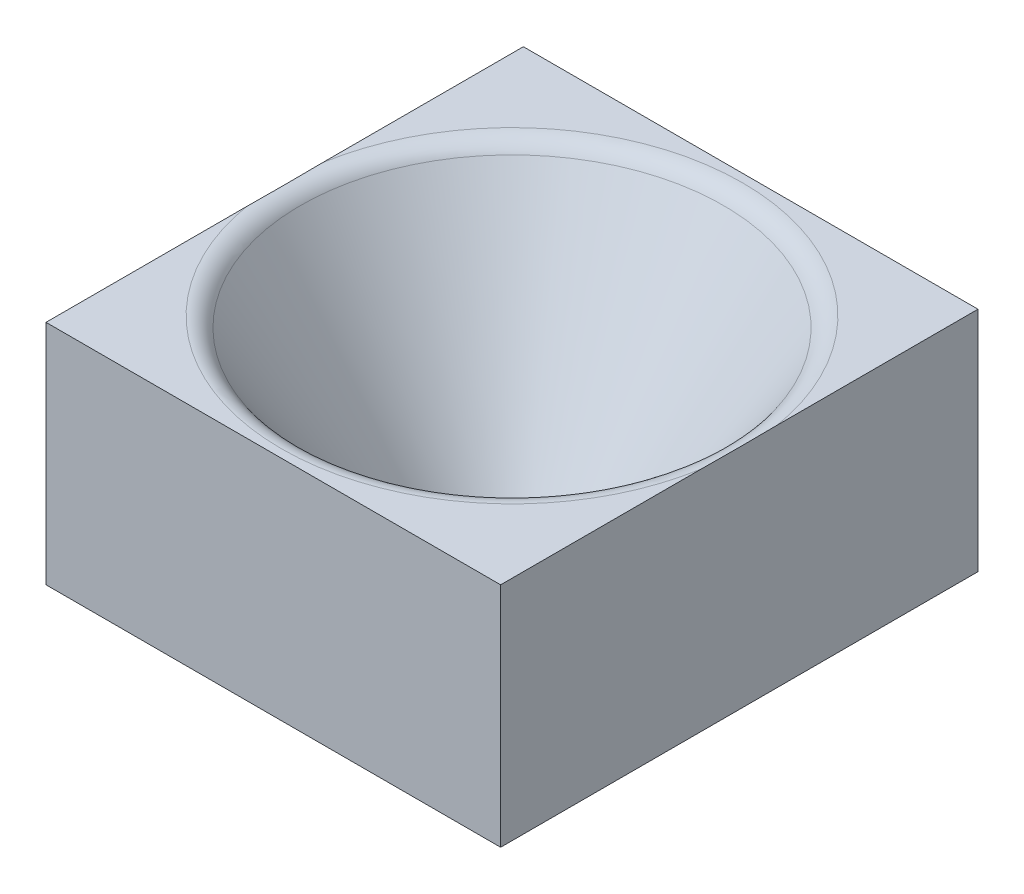
ISO-10303-21;
HEADER;
FILE_DESCRIPTION(('STEP AP214'),'2;1');
FILE_NAME('part.step','',(''),(''),'','','');
FILE_SCHEMA(('AUTOMOTIVE_DESIGN { 1 0 10303 214 1 1 1 1 }'));
ENDSEC;
DATA;
#1=APPLICATION_CONTEXT('core data for automotive mechanical design processes');
#2=APPLICATION_PROTOCOL_DEFINITION('international standard','automotive_design',2000,#1);
#3=PRODUCT_CONTEXT('',#1,'mechanical');
#4=PRODUCT('Part','Part','',(#3));
#5=PRODUCT_RELATED_PRODUCT_CATEGORY('part','',(#4));
#6=PRODUCT_DEFINITION_FORMATION('','',#4);
#7=PRODUCT_DEFINITION_CONTEXT('part definition',#1,'design');
#8=PRODUCT_DEFINITION('design','',#6,#7);
#9=PRODUCT_DEFINITION_SHAPE('','',#8);
#10=(LENGTH_UNIT() NAMED_UNIT(*) SI_UNIT(.MILLI.,.METRE.));
#11=(NAMED_UNIT(*) PLANE_ANGLE_UNIT() SI_UNIT($,.RADIAN.));
#12=(NAMED_UNIT(*) SI_UNIT($,.STERADIAN.) SOLID_ANGLE_UNIT());
#13=UNCERTAINTY_MEASURE_WITH_UNIT(LENGTH_MEASURE(1.E-05),#10,'distance_accuracy_value','');
#14=(GEOMETRIC_REPRESENTATION_CONTEXT(3) GLOBAL_UNCERTAINTY_ASSIGNED_CONTEXT((#13)) GLOBAL_UNIT_ASSIGNED_CONTEXT((#10,
#11,#12)) REPRESENTATION_CONTEXT('',''));
#15=CARTESIAN_POINT('',(0.,0.,0.));
#16=DIRECTION('',(0.,0.,1.));
#17=DIRECTION('',(1.,0.,0.));
#18=AXIS2_PLACEMENT_3D('',#15,#16,#17);
#19=CARTESIAN_POINT('',(-17.3,30.,48.5732994259089));
#20=DIRECTION('',(-1.,0.,0.));
#21=DIRECTION('',(0.,0.,1.));
#22=AXIS2_PLACEMENT_3D('',#19,#20,#21);
#23=PLANE('',#22);
#24=DIRECTION('',(0.,0.,1.));
#25=VECTOR('',#24,1.);
#26=CARTESIAN_POINT('',(-17.3,12.,48.5732994259089));
#27=LINE('',#26,#25);
#28=CARTESIAN_POINT('',(-17.3,12.,36.0732994259089));
#29=VERTEX_POINT('',#28);
#30=CARTESIAN_POINT('',(-17.3,12.,48.5732994259089));
#31=VERTEX_POINT('',#30);
#32=EDGE_CURVE('E176',#29,#31,#27,.T.);
#33=ORIENTED_EDGE('',*,*,#32,.F.);
#34=DIRECTION('',(0.,-1.,0.));
#35=VECTOR('',#34,1.);
#36=CARTESIAN_POINT('',(-17.3,30.,36.0732994259089));
#37=LINE('',#36,#35);
#38=CARTESIAN_POINT('',(-17.3,30.,36.0732994259089));
#39=VERTEX_POINT('',#38);
#40=EDGE_CURVE('E151',#39,#29,#37,.T.);
#41=ORIENTED_EDGE('',*,*,#40,.F.);
#42=DIRECTION('',(0.,0.,-1.));
#43=VECTOR('',#42,1.);
#44=CARTESIAN_POINT('',(-17.3,30.,48.5732994259089));
#45=LINE('',#44,#43);
#46=CARTESIAN_POINT('',(-17.3,30.,48.5732994259089));
#47=VERTEX_POINT('',#46);
#48=EDGE_CURVE('E179',#47,#39,#45,.T.);
#49=ORIENTED_EDGE('',*,*,#48,.F.);
#50=DIRECTION('',(0.,-1.,0.));
#51=VECTOR('',#50,1.);
#52=CARTESIAN_POINT('',(-17.3,30.,48.5732994259089));
#53=LINE('',#52,#51);
#54=EDGE_CURVE('E194',#47,#31,#53,.T.);
#55=ORIENTED_EDGE('',*,*,#54,.T.);
#56=EDGE_LOOP('',(#33,#41,#49,#55));
#57=FACE_BOUND('',#56,.T.);
#58=ADVANCED_FACE('F34',(#57),#23,.F.);
#59=CARTESIAN_POINT('',(5.2,30.,48.5732994259089));
#60=DIRECTION('',(1.,0.,0.));
#61=DIRECTION('',(0.,0.,-1.));
#62=AXIS2_PLACEMENT_3D('',#59,#60,#61);
#63=PLANE('',#62);
#64=DIRECTION('',(0.,0.,-1.));
#65=VECTOR('',#64,1.);
#66=CARTESIAN_POINT('',(5.2,12.,48.5732994259089));
#67=LINE('',#66,#65);
#68=CARTESIAN_POINT('',(5.2,12.,48.5732994259089));
#69=VERTEX_POINT('',#68);
#70=CARTESIAN_POINT('',(5.2,12.,36.0732994259089));
#71=VERTEX_POINT('',#70);
#72=EDGE_CURVE('E169',#69,#71,#67,.T.);
#73=ORIENTED_EDGE('',*,*,#72,.F.);
#74=DIRECTION('',(0.,-1.,0.));
#75=VECTOR('',#74,1.);
#76=CARTESIAN_POINT('',(5.2,30.,48.5732994259089));
#77=LINE('',#76,#75);
#78=CARTESIAN_POINT('',(5.2,30.,48.5732994259089));
#79=VERTEX_POINT('',#78);
#80=EDGE_CURVE('E198',#79,#69,#77,.T.);
#81=ORIENTED_EDGE('',*,*,#80,.F.);
#82=DIRECTION('',(0.,0.,1.));
#83=VECTOR('',#82,1.);
#84=CARTESIAN_POINT('',(5.2,30.,48.5732994259089));
#85=LINE('',#84,#83);
#86=CARTESIAN_POINT('',(5.2,30.,36.0732994259089));
#87=VERTEX_POINT('',#86);
#88=EDGE_CURVE('E186',#87,#79,#85,.T.);
#89=ORIENTED_EDGE('',*,*,#88,.F.);
#90=DIRECTION('',(0.,-1.,0.));
#91=VECTOR('',#90,1.);
#92=CARTESIAN_POINT('',(5.2,30.,36.0732994259089));
#93=LINE('',#92,#91);
#94=EDGE_CURVE('E201',#87,#71,#93,.T.);
#95=ORIENTED_EDGE('',*,*,#94,.T.);
#96=EDGE_LOOP('',(#73,#81,#89,#95));
#97=FACE_BOUND('',#96,.T.);
#98=ADVANCED_FACE('F274',(#97),#63,.F.);
#99=CARTESIAN_POINT('',(0.,50.,0.));
#100=DIRECTION('',(0.,1.,0.));
#101=DIRECTION('',(0.,0.,1.));
#102=AXIS2_PLACEMENT_3D('',#99,#100,#101);
#103=PLANE('',#102);
#104=DIRECTION('',(0.,0.,1.));
#105=VECTOR('',#104,1.);
#106=CARTESIAN_POINT('',(-50.,50.,-52.5));
#107=LINE('',#106,#105);
#108=CARTESIAN_POINT('',(-50.,50.,-52.5));
#109=VERTEX_POINT('',#108);
#110=CARTESIAN_POINT('',(-50.,50.,-8.34025617321344));
#111=VERTEX_POINT('',#110);
#112=EDGE_CURVE('E208',#109,#111,#107,.T.);
#113=ORIENTED_EDGE('',*,*,#112,.T.);
#114=CARTESIAN_POINT('',(0.,50.,0.));
#115=DIRECTION('',(0.,1.,0.));
#116=DIRECTION('',(0.,0.,1.));
#117=AXIS2_PLACEMENT_3D('',#114,#115,#116);
#118=CIRCLE('',#117,50.6908263203001);
#119=CARTESIAN_POINT('',(50.,50.,-8.34025617321344));
#120=VERTEX_POINT('',#119);
#121=EDGE_CURVE('E242',#111,#120,#118,.F.);
#122=ORIENTED_EDGE('',*,*,#121,.T.);
#123=DIRECTION('',(0.,0.,-1.));
#124=VECTOR('',#123,1.);
#125=CARTESIAN_POINT('',(50.,50.,-52.5));
#126=LINE('',#125,#124);
#127=CARTESIAN_POINT('',(50.,50.,-52.5));
#128=VERTEX_POINT('',#127);
#129=EDGE_CURVE('E214',#120,#128,#126,.T.);
#130=ORIENTED_EDGE('',*,*,#129,.T.);
#131=DIRECTION('',(-1.,0.,0.));
#132=VECTOR('',#131,1.);
#133=CARTESIAN_POINT('',(-50.,50.,-52.5));
#134=LINE('',#133,#132);
#135=EDGE_CURVE('E218',#128,#109,#134,.T.);
#136=ORIENTED_EDGE('',*,*,#135,.T.);
#137=EDGE_LOOP('',(#113,#122,#130,#136));
#138=FACE_BOUND('',#137,.T.);
#139=ADVANCED_FACE('F269',(#138),#103,.T.);
#140=CARTESIAN_POINT('',(-50.,50.,-52.5));
#141=DIRECTION('',(1.,0.,0.));
#142=DIRECTION('',(0.,0.,-1.));
#143=AXIS2_PLACEMENT_3D('',#140,#141,#142);
#144=PLANE('',#143);
#145=CARTESIAN_POINT('',(-50.,50.,8.34025617321344));
#146=VERTEX_POINT('',#145);
#147=CARTESIAN_POINT('',(-50.,50.,52.5));
#148=VERTEX_POINT('',#147);
#149=EDGE_CURVE('E212',#146,#148,#107,.T.);
#150=ORIENTED_EDGE('',*,*,#149,.F.);
#151=CARTESIAN_POINT('',(-50.,50.,8.34025617321344));
#152=CARTESIAN_POINT('',(-50.,49.999969519548,7.92357488045374));
#153=CARTESIAN_POINT('',(-50.,49.9985889554185,7.50689862755486));
#154=CARTESIAN_POINT('',(-50.,49.9941415827131,6.67355809485329));
#155=CARTESIAN_POINT('',(-50.,49.9910747889397,6.25689381497759));
#156=CARTESIAN_POINT('',(-50.,49.9842687425218,5.42355941569079));
#157=CARTESIAN_POINT('',(-50.,49.9805294698827,5.0068892964745));
#158=CARTESIAN_POINT('',(-50.,49.9731743613539,4.17354696788151));
#159=CARTESIAN_POINT('',(-50.,49.9695585256897,3.75687475850238));
#160=CARTESIAN_POINT('',(-50.,49.9630782107833,2.92354241923249));
#161=CARTESIAN_POINT('',(-50.,49.9602136987209,2.50688228960933));
#162=CARTESIAN_POINT('',(-50.,49.9556705476822,1.67355563993624));
#163=CARTESIAN_POINT('',(-50.,49.9539919075349,1.25688911989303));
#164=CARTESIAN_POINT('',(-50.,49.9520592996897,0.423560225945266));
#165=CARTESIAN_POINT('',(-50.,49.9518053059902,0.0068978521038454));
#166=CARTESIAN_POINT('',(-50.,49.9527544558587,-0.826425291643721));
#167=CARTESIAN_POINT('',(-50.,49.9539575999139,-1.24308606154928));
#168=CARTESIAN_POINT('',(-50.,49.9582846415786,-2.21644720256942));
#169=CARTESIAN_POINT('',(-50.,49.9619182119532,-2.77314521439534));
#170=CARTESIAN_POINT('',(-50.,49.97055742349,-3.88653516263361));
#171=CARTESIAN_POINT('',(-50.,49.9755630791267,-4.44322709891992));
#172=CARTESIAN_POINT('',(-50.,49.9853841369986,-5.55663372886826));
#173=CARTESIAN_POINT('',(-50.,49.9901995322325,-6.11334842261453));
#174=CARTESIAN_POINT('',(-50.,49.9956771546948,-6.94843121544724));
#175=CARTESIAN_POINT('',(-50.,49.9972121147607,-7.22679294777492));
#176=CARTESIAN_POINT('',(-50.,49.9993713262338,-7.78352143427091));
#177=CARTESIAN_POINT('',(-50.,49.9999955721802,-8.06188818845933));
#178=CARTESIAN_POINT('',(-50.,50.,-8.34025617321344));
#179=B_SPLINE_CURVE_WITH_KNOTS('',3,(#151,#152,#153,#154,#155,#156,#157,#158,#159,#160,#161,
#162,#163,#164,#165,#166,#167,#168,#169,#170,#171,#172,#173,#174,#175,#176,#177,#178),
.UNSPECIFIED.,.F.,.F.,(4,2,2,2,2,2,2,2,2,2,2,2,2,4),(0.,1.25003492526919,2.50005887721272,
3.7501200017694,5.00018340936057,6.25019220102845,7.50019975841729,8.75018450153355,
10.0001696624963,11.670295643204,13.3404392431921,15.0106442443051,15.8457408010041,
16.6808423649642),.UNSPECIFIED.);
#180=EDGE_CURVE('E43',#146,#111,#179,.T.);
#181=ORIENTED_EDGE('',*,*,#180,.T.);
#182=ORIENTED_EDGE('',*,*,#112,.F.);
#183=DIRECTION('',(0.,-1.,0.));
#184=VECTOR('',#183,1.);
#185=CARTESIAN_POINT('',(-50.,50.,-52.5));
#186=LINE('',#185,#184);
#187=CARTESIAN_POINT('',(-50.,0.,-52.5));
#188=VERTEX_POINT('',#187);
#189=EDGE_CURVE('E220',#109,#188,#186,.T.);
#190=ORIENTED_EDGE('',*,*,#189,.T.);
#191=DIRECTION('',(0.,0.,1.));
#192=VECTOR('',#191,1.);
#193=CARTESIAN_POINT('',(-50.,0.,-52.5));
#194=LINE('',#193,#192);
#195=CARTESIAN_POINT('',(-50.,0.,52.5));
#196=VERTEX_POINT('',#195);
#197=EDGE_CURVE('E207',#188,#196,#194,.T.);
#198=ORIENTED_EDGE('',*,*,#197,.T.);
#199=DIRECTION('',(0.,-1.,0.));
#200=VECTOR('',#199,1.);
#201=CARTESIAN_POINT('',(-50.,50.,52.5));
#202=LINE('',#201,#200);
#203=EDGE_CURVE('E237',#148,#196,#202,.T.);
#204=ORIENTED_EDGE('',*,*,#203,.F.);
#205=EDGE_LOOP('',(#150,#181,#182,#190,#198,#204));
#206=FACE_BOUND('',#205,.T.);
#207=ADVANCED_FACE('F265',(#206),#144,.F.);
#208=CARTESIAN_POINT('',(-50.,50.,52.5));
#209=DIRECTION('',(0.,0.,-1.));
#210=DIRECTION('',(-1.,0.,0.));
#211=AXIS2_PLACEMENT_3D('',#208,#209,#210);
#212=PLANE('',#211);
#213=DIRECTION('',(1.,0.,0.));
#214=VECTOR('',#213,1.);
#215=CARTESIAN_POINT('',(-50.,0.,52.5));
#216=LINE('',#215,#214);
#217=CARTESIAN_POINT('',(50.,0.,52.5));
#218=VERTEX_POINT('',#217);
#219=EDGE_CURVE('E223',#196,#218,#216,.T.);
#220=ORIENTED_EDGE('',*,*,#219,.T.);
#221=DIRECTION('',(0.,-1.,0.));
#222=VECTOR('',#221,1.);
#223=CARTESIAN_POINT('',(50.,50.,52.5));
#224=LINE('',#223,#222);
#225=CARTESIAN_POINT('',(50.,50.,52.5));
#226=VERTEX_POINT('',#225);
#227=EDGE_CURVE('E234',#226,#218,#224,.T.);
#228=ORIENTED_EDGE('',*,*,#227,.F.);
#229=DIRECTION('',(1.,0.,0.));
#230=VECTOR('',#229,1.);
#231=CARTESIAN_POINT('',(-50.,50.,52.5));
#232=LINE('',#231,#230);
#233=EDGE_CURVE('E211',#148,#226,#232,.T.);
#234=ORIENTED_EDGE('',*,*,#233,.F.);
#235=ORIENTED_EDGE('',*,*,#203,.T.);
#236=EDGE_LOOP('',(#220,#228,#234,#235));
#237=FACE_BOUND('',#236,.T.);
#238=ADVANCED_FACE('F261',(#237),#212,.F.);
#239=CARTESIAN_POINT('',(50.,50.,-52.5));
#240=DIRECTION('',(-1.,0.,0.));
#241=DIRECTION('',(0.,0.,1.));
#242=AXIS2_PLACEMENT_3D('',#239,#240,#241);
#243=PLANE('',#242);
#244=ORIENTED_EDGE('',*,*,#129,.F.);
#245=CARTESIAN_POINT('',(50.,50.,-8.34025617321344));
#246=CARTESIAN_POINT('',(50.,49.999969519548,-7.92357488045374));
#247=CARTESIAN_POINT('',(50.,49.9985889554185,-7.50689862755486));
#248=CARTESIAN_POINT('',(50.,49.9941415827131,-6.67355809485329));
#249=CARTESIAN_POINT('',(50.,49.9910747889397,-6.25689381497759));
#250=CARTESIAN_POINT('',(50.,49.9842687425218,-5.42355941569079));
#251=CARTESIAN_POINT('',(50.,49.9805294698827,-5.0068892964745));
#252=CARTESIAN_POINT('',(50.,49.9731743613539,-4.17354696788151));
#253=CARTESIAN_POINT('',(50.,49.9695585256897,-3.75687475850238));
#254=CARTESIAN_POINT('',(50.,49.9630782107833,-2.92354241923249));
#255=CARTESIAN_POINT('',(50.,49.9602136987209,-2.50688228960933));
#256=CARTESIAN_POINT('',(50.,49.9556705476822,-1.67355563993624));
#257=CARTESIAN_POINT('',(50.,49.9539919075349,-1.25688911989303));
#258=CARTESIAN_POINT('',(50.,49.9520592996897,-0.423560225945266));
#259=CARTESIAN_POINT('',(50.,49.9518053059902,-0.0068978521038454));
#260=CARTESIAN_POINT('',(50.,49.9527544558587,0.826425291643721));
#261=CARTESIAN_POINT('',(50.,49.9539575999139,1.24308606154928));
#262=CARTESIAN_POINT('',(50.,49.9582846415786,2.21644720256942));
#263=CARTESIAN_POINT('',(50.,49.9619182119532,2.77314521439534));
#264=CARTESIAN_POINT('',(50.,49.97055742349,3.88653516263361));
#265=CARTESIAN_POINT('',(50.,49.9755630791267,4.44322709891992));
#266=CARTESIAN_POINT('',(50.,49.9853841369986,5.55663372886826));
#267=CARTESIAN_POINT('',(50.,49.9901995322325,6.11334842261453));
#268=CARTESIAN_POINT('',(50.,49.9956771546948,6.94843121544724));
#269=CARTESIAN_POINT('',(50.,49.9972121147607,7.22679294777492));
#270=CARTESIAN_POINT('',(50.,49.9993713262338,7.78352143427091));
#271=CARTESIAN_POINT('',(50.,49.9999955721802,8.06188818845933));
#272=CARTESIAN_POINT('',(50.,50.,8.34025617321344));
#273=B_SPLINE_CURVE_WITH_KNOTS('',3,(#245,#246,#247,#248,#249,#250,#251,#252,#253,#254,#255,
#256,#257,#258,#259,#260,#261,#262,#263,#264,#265,#266,#267,#268,#269,#270,#271,#272),
.UNSPECIFIED.,.F.,.F.,(4,2,2,2,2,2,2,2,2,2,2,2,2,4),(0.,1.25003492526919,2.50005887721272,
3.7501200017694,5.00018340936057,6.25019220102845,7.50019975841729,8.75018450153355,
10.0001696624963,11.670295643204,13.3404392431921,15.0106442443051,15.8457408010041,
16.6808423649642),.UNSPECIFIED.);
#274=CARTESIAN_POINT('',(50.,50.,8.34025617321344));
#275=VERTEX_POINT('',#274);
#276=EDGE_CURVE('E245',#120,#275,#273,.T.);
#277=ORIENTED_EDGE('',*,*,#276,.T.);
#278=EDGE_CURVE('E215',#226,#275,#126,.T.);
#279=ORIENTED_EDGE('',*,*,#278,.F.);
#280=ORIENTED_EDGE('',*,*,#227,.T.);
#281=DIRECTION('',(0.,0.,-1.));
#282=VECTOR('',#281,1.);
#283=CARTESIAN_POINT('',(50.,0.,-52.5));
#284=LINE('',#283,#282);
#285=CARTESIAN_POINT('',(50.,0.,-52.5));
#286=VERTEX_POINT('',#285);
#287=EDGE_CURVE('E225',#218,#286,#284,.T.);
#288=ORIENTED_EDGE('',*,*,#287,.T.);
#289=DIRECTION('',(0.,-1.,0.));
#290=VECTOR('',#289,1.);
#291=CARTESIAN_POINT('',(50.,50.,-52.5));
#292=LINE('',#291,#290);
#293=EDGE_CURVE('E231',#128,#286,#292,.T.);
#294=ORIENTED_EDGE('',*,*,#293,.F.);
#295=EDGE_LOOP('',(#244,#277,#279,#280,#288,#294));
#296=FACE_BOUND('',#295,.T.);
#297=ADVANCED_FACE('F255',(#296),#243,.F.);
#298=CARTESIAN_POINT('',(-50.,50.,-52.5));
#299=DIRECTION('',(0.,0.,1.));
#300=DIRECTION('',(1.,0.,0.));
#301=AXIS2_PLACEMENT_3D('',#298,#299,#300);
#302=PLANE('',#301);
#303=DIRECTION('',(-1.,0.,0.));
#304=VECTOR('',#303,1.);
#305=CARTESIAN_POINT('',(-50.,0.,-52.5));
#306=LINE('',#305,#304);
#307=EDGE_CURVE('E227',#286,#188,#306,.T.);
#308=ORIENTED_EDGE('',*,*,#307,.T.);
#309=ORIENTED_EDGE('',*,*,#189,.F.);
#310=ORIENTED_EDGE('',*,*,#135,.F.);
#311=ORIENTED_EDGE('',*,*,#293,.T.);
#312=EDGE_LOOP('',(#308,#309,#310,#311));
#313=FACE_BOUND('',#312,.T.);
#314=ADVANCED_FACE('F260',(#313),#302,.F.);
#315=ORIENTED_EDGE('',*,*,#278,.T.);
#316=CARTESIAN_POINT('',(0.,50.,0.));
#317=DIRECTION('',(0.,1.,0.));
#318=DIRECTION('',(0.,0.,1.));
#319=AXIS2_PLACEMENT_3D('',#316,#317,#318);
#320=CIRCLE('',#319,50.6908263203001);
#321=EDGE_CURVE('E240',#275,#146,#320,.F.);
#322=ORIENTED_EDGE('',*,*,#321,.T.);
#323=ORIENTED_EDGE('',*,*,#149,.T.);
#324=ORIENTED_EDGE('',*,*,#233,.T.);
#325=EDGE_LOOP('',(#315,#322,#323,#324));
#326=FACE_BOUND('',#325,.T.);
#327=ADVANCED_FACE('F277',(#326),#103,.T.);
#328=CARTESIAN_POINT('',(0.,0.,0.));
#329=DIRECTION('',(0.,1.,0.));
#330=DIRECTION('',(0.,0.,1.));
#331=AXIS2_PLACEMENT_3D('',#328,#329,#330);
#332=PLANE('',#331);
#333=DIRECTION('',(-1.,0.,0.));
#334=VECTOR('',#333,1.);
#335=CARTESIAN_POINT('',(-17.3,0.,48.5732994259089));
#336=LINE('',#335,#334);
#337=CARTESIAN_POINT('',(10.7,0.,48.5732994259089));
#338=VERTEX_POINT('',#337);
#339=CARTESIAN_POINT('',(-22.8,0.,48.5732994259089));
#340=VERTEX_POINT('',#339);
#341=EDGE_CURVE('E183',#338,#340,#336,.T.);
#342=ORIENTED_EDGE('',*,*,#341,.F.);
#343=DIRECTION('',(0.,0.,1.));
#344=VECTOR('',#343,1.);
#345=CARTESIAN_POINT('',(10.7,0.,48.5732994259089));
#346=LINE('',#345,#344);
#347=CARTESIAN_POINT('',(10.7,0.,36.0732994259089));
#348=VERTEX_POINT('',#347);
#349=EDGE_CURVE('E159',#348,#338,#346,.T.);
#350=ORIENTED_EDGE('',*,*,#349,.F.);
#351=DIRECTION('',(1.,0.,0.));
#352=VECTOR('',#351,1.);
#353=CARTESIAN_POINT('',(-17.3,0.,36.0732994259089));
#354=LINE('',#353,#352);
#355=CARTESIAN_POINT('',(-22.8,0.,36.0732994259089));
#356=VERTEX_POINT('',#355);
#357=EDGE_CURVE('E178',#356,#348,#354,.T.);
#358=ORIENTED_EDGE('',*,*,#357,.F.);
#359=DIRECTION('',(0.,0.,-1.));
#360=VECTOR('',#359,1.);
#361=CARTESIAN_POINT('',(-22.8,0.,48.5732994259089));
#362=LINE('',#361,#360);
#363=EDGE_CURVE('E144',#340,#356,#362,.T.);
#364=ORIENTED_EDGE('',*,*,#363,.F.);
#365=EDGE_LOOP('',(#342,#350,#358,#364));
#366=FACE_BOUND('',#365,.T.);
#367=CARTESIAN_POINT('',(0.,0.,0.));
#368=DIRECTION('',(0.,-1.,0.));
#369=DIRECTION('',(0.,0.,-1.));
#370=AXIS2_PLACEMENT_3D('',#367,#368,#369);
#371=CIRCLE('',#370,15.);
#372=CARTESIAN_POINT('',(0.,0.,15.));
#373=VERTEX_POINT('',#372);
#374=EDGE_CURVE('E197',#373,#373,#371,.T.);
#375=ORIENTED_EDGE('',*,*,#374,.F.);
#376=EDGE_LOOP('',(#375));
#377=FACE_BOUND('',#376,.T.);
#378=ORIENTED_EDGE('',*,*,#197,.F.);
#379=ORIENTED_EDGE('',*,*,#307,.F.);
#380=ORIENTED_EDGE('',*,*,#287,.F.);
#381=ORIENTED_EDGE('',*,*,#219,.F.);
#382=EDGE_LOOP('',(#378,#379,#380,#381));
#383=FACE_BOUND('',#382,.T.);
#384=ADVANCED_FACE('F291',(#366,#377,#383),#332,.F.);
#385=CARTESIAN_POINT('',(0.,50.,0.));
#386=DIRECTION('',(0.,1.,0.));
#387=DIRECTION('',(0.,0.,1.));
#388=AXIS2_PLACEMENT_3D('',#385,#386,#387);
#389=CONICAL_SURFACE('',#388,48.,0.583373006993856);
#390=CARTESIAN_POINT('',(0.,47.7542110416537,0.));
#391=DIRECTION('',(0.,-1.,0.));
#392=DIRECTION('',(0.,0.,-1.));
#393=AXIS2_PLACEMENT_3D('',#390,#391,#392);
#394=CIRCLE('',#393,46.5177792874914);
#395=CARTESIAN_POINT('',(0.,47.7542110416537,46.5177792874914));
#396=VERTEX_POINT('',#395);
#397=EDGE_CURVE('E11',#396,#396,#394,.F.);
#398=CARTESIAN_POINT('',(0.,47.7542110416537,46.5177792874914));
#399=CARTESIAN_POINT('',(0.,47.2567713433031,46.1894690865801));
#400=CARTESIAN_POINT('',(0.,46.7593316449526,45.8611588856687));
#401=CARTESIAN_POINT('',(0.,45.7644522482515,45.204538483846));
#402=CARTESIAN_POINT('',(0.,45.2670125499009,44.8762282829346));
#403=CARTESIAN_POINT('',(0.,44.2721331531998,44.2196078811119));
#404=CARTESIAN_POINT('',(0.,43.7746934548492,43.8912976802005));
#405=CARTESIAN_POINT('',(0.,42.7798140581481,43.2346772783778));
#406=CARTESIAN_POINT('',(0.,42.2823743597976,42.9063670774664));
#407=CARTESIAN_POINT('',(0.,41.2874949630964,42.2497466756436));
#408=CARTESIAN_POINT('',(0.,40.7900552647459,41.9214364747323));
#409=CARTESIAN_POINT('',(0.,39.7951758680448,41.2648160729095));
#410=CARTESIAN_POINT('',(0.,39.2977361696942,40.9365058719982));
#411=CARTESIAN_POINT('',(0.,38.3028567729931,40.2798854701754));
#412=CARTESIAN_POINT('',(0.,37.8054170746425,39.9515752692641));
#413=CARTESIAN_POINT('',(0.,36.8105376779414,39.2949548674413));
#414=CARTESIAN_POINT('',(0.,36.3130979795908,38.96664466653));
#415=CARTESIAN_POINT('',(0.,35.3182185828897,38.3100242647072));
#416=CARTESIAN_POINT('',(0.,34.8207788845392,37.9817140637958));
#417=CARTESIAN_POINT('',(0.,33.825899487838,37.3250936619731));
#418=CARTESIAN_POINT('',(0.,33.3284597894875,36.9967834610617));
#419=CARTESIAN_POINT('',(0.,32.3335803927864,36.340163059239));
#420=CARTESIAN_POINT('',(0.,31.8361406944358,36.0118528583276));
#421=CARTESIAN_POINT('',(0.,30.8412612977347,35.3552324565049));
#422=CARTESIAN_POINT('',(0.,30.3438215993841,35.0269222555935));
#423=CARTESIAN_POINT('',(0.,29.348942202683,34.3703018537708));
#424=CARTESIAN_POINT('',(0.,28.8515025043324,34.0419916528594));
#425=CARTESIAN_POINT('',(0.,27.8566231076313,33.3853712510367));
#426=CARTESIAN_POINT('',(0.,27.3591834092808,33.0570610501253));
#427=CARTESIAN_POINT('',(0.,26.3643040125796,32.4004406483026));
#428=CARTESIAN_POINT('',(0.,25.8668643142291,32.0721304473912));
#429=CARTESIAN_POINT('',(0.,24.871984917528,31.4155100455685));
#430=CARTESIAN_POINT('',(0.,24.3745452191774,31.0871998446571));
#431=CARTESIAN_POINT('',(0.,23.3796658224763,30.4305794428344));
#432=CARTESIAN_POINT('',(0.,22.8822261241257,30.102269241923));
#433=CARTESIAN_POINT('',(0.,21.8873467274246,29.4456488401002));
#434=CARTESIAN_POINT('',(0.,21.3899070290741,29.1173386391889));
#435=CARTESIAN_POINT('',(0.,20.3950276323729,28.4607182373661));
#436=CARTESIAN_POINT('',(0.,19.8975879340224,28.1324080364548));
#437=CARTESIAN_POINT('',(0.,18.9027085373213,27.475787634632));
#438=CARTESIAN_POINT('',(0.,18.4052688389707,27.1474774337207));
#439=CARTESIAN_POINT('',(0.,17.4103894422696,26.4908570318979));
#440=CARTESIAN_POINT('',(0.,16.912949743919,26.1625468309866));
#441=CARTESIAN_POINT('',(0.,15.9180703472179,25.5059264291638));
#442=CARTESIAN_POINT('',(0.,15.4206306488673,25.1776162282524));
#443=CARTESIAN_POINT('',(0.,14.4257512521662,24.5209958264297));
#444=CARTESIAN_POINT('',(0.,13.9283115538157,24.1926856255183));
#445=CARTESIAN_POINT('',(0.,12.9334321571146,23.5360652236956));
#446=CARTESIAN_POINT('',(0.,12.435992458764,23.2077550227842));
#447=CARTESIAN_POINT('',(0.,11.4411130620629,22.5511346209615));
#448=CARTESIAN_POINT('',(0.,10.9436733637123,22.2228244200501));
#449=CARTESIAN_POINT('',(0.,9.94879396701119,21.5662040182274));
#450=CARTESIAN_POINT('',(0.,9.45135426866063,21.237893817316));
#451=CARTESIAN_POINT('',(0.,8.45647487195951,20.5812734154933));
#452=CARTESIAN_POINT('',(0.,7.95903517360895,20.2529632145819));
#453=CARTESIAN_POINT('',(0.,6.96415577690783,19.5963428127592));
#454=CARTESIAN_POINT('',(0.,6.46671607855727,19.2680326118478));
#455=CARTESIAN_POINT('',(0.,5.47183668185615,18.6114122100251));
#456=CARTESIAN_POINT('',(0.,4.9743969835056,18.2831020091137));
#457=CARTESIAN_POINT('',(0.,3.97951758680448,17.626481607291));
#458=CARTESIAN_POINT('',(0.,3.48207788845392,17.2981714063796));
#459=CARTESIAN_POINT('',(0.,2.4871984917528,16.6415510045569));
#460=CARTESIAN_POINT('',(0.,1.98975879340224,16.3132408036455));
#461=CARTESIAN_POINT('',(0.,0.99487939670112,15.6566204018227));
#462=CARTESIAN_POINT('',(0.,0.49743969835056,15.3283102009114));
#463=CARTESIAN_POINT('',(0.,0.,15.));
#464=B_SPLINE_CURVE_WITH_KNOTS('',3,(#398,#399,#400,#401,#402,#403,#404,#405,#406,#407,#408,
#409,#410,#411,#412,#413,#414,#415,#416,#417,#418,#419,#420,#421,#422,#423,#424,#425,#426,#427,
#428,#429,#430,#431,#432,#433,#434,#435,#436,#437,#438,#439,#440,#441,#442,#443,#444,#445,#446,
#447,#448,#449,#450,#451,#452,#453,#454,#455,#456,#457,#458,#459,#460,#461,#462,#463),
.UNSPECIFIED.,.F.,.F.,(4,2,2,2,2,2,2,2,2,2,2,2,2,2,2,2,2,2,2,2,2,2,2,2,2,2,2,2,2,2,2,2,4),(0.,
1.78804490258439,3.57608980516879,5.36413470775318,7.15217961033757,8.94022451292197,
10.7282694155064,12.5163143180907,14.3043592206751,16.0924041232595,17.8804490258439,
19.6684939284283,21.4565388310127,23.2445837335971,25.0326286361815,26.8206735387659,
28.6087184413503,30.3967633439347,32.1848082465191,33.9728531491035,35.7608980516879,
37.5489429542723,39.3369878568567,41.125032759441,42.9130776620254,44.7011225646098,
46.4891674671942,48.2772123697786,50.065257272363,51.8533021749474,53.6413470775318,
55.4293919801162,57.2174368827006),.UNSPECIFIED.);
#465=EDGE_CURVE('BSEAM289',#396,#373,#464,.T.);
#466=ORIENTED_EDGE('',*,*,#397,.T.);
#467=ORIENTED_EDGE('',*,*,#374,.T.);
#468=ORIENTED_EDGE('',*,*,#465,.T.);
#469=ORIENTED_EDGE('',*,*,#465,.F.);
#470=EDGE_LOOP('',(#466,#468,#467,#469));
#471=FACE_BOUND('',#470,.T.);
#472=ADVANCED_FACE('F289',(#471),#389,.F.);
#473=CARTESIAN_POINT('',(0.,45.,0.));
#474=DIRECTION('',(0.,1.,0.));
#475=DIRECTION('',(0.,0.,1.));
#476=AXIS2_PLACEMENT_3D('',#473,#474,#475);
#477=TOROIDAL_SURFACE('',#476,50.6908263203001,5.);
#478=ORIENTED_EDGE('',*,*,#397,.F.);
#479=EDGE_LOOP('',(#478));
#480=FACE_BOUND('',#479,.T.);
#481=ORIENTED_EDGE('',*,*,#276,.F.);
#482=ORIENTED_EDGE('',*,*,#121,.F.);
#483=ORIENTED_EDGE('',*,*,#180,.F.);
#484=ORIENTED_EDGE('',*,*,#321,.F.);
#485=EDGE_LOOP('',(#481,#482,#483,#484));
#486=FACE_BOUND('',#485,.T.);
#487=ADVANCED_FACE('F36',(#480,#486),#477,.T.);
#488=CARTESIAN_POINT('',(-17.3,30.,48.5732994259089));
#489=DIRECTION('',(0.,0.,1.));
#490=DIRECTION('',(1.,0.,0.));
#491=AXIS2_PLACEMENT_3D('',#488,#489,#490);
#492=PLANE('',#491);
#493=ORIENTED_EDGE('',*,*,#341,.T.);
#494=DIRECTION('',(0.,-1.,0.));
#495=VECTOR('',#494,1.);
#496=CARTESIAN_POINT('',(-22.8,12.,48.5732994259089));
#497=LINE('',#496,#495);
#498=CARTESIAN_POINT('',(-22.8,12.,48.5732994259089));
#499=VERTEX_POINT('',#498);
#500=EDGE_CURVE('E167',#499,#340,#497,.T.);
#501=ORIENTED_EDGE('',*,*,#500,.F.);
#502=DIRECTION('',(-1.,0.,0.));
#503=VECTOR('',#502,1.);
#504=CARTESIAN_POINT('',(-22.8,12.,48.5732994259089));
#505=LINE('',#504,#503);
#506=EDGE_CURVE('E157',#31,#499,#505,.T.);
#507=ORIENTED_EDGE('',*,*,#506,.F.);
#508=ORIENTED_EDGE('',*,*,#54,.F.);
#509=DIRECTION('',(-1.,0.,0.));
#510=VECTOR('',#509,1.);
#511=CARTESIAN_POINT('',(-17.3,30.,48.5732994259089));
#512=LINE('',#511,#510);
#513=EDGE_CURVE('E189',#79,#47,#512,.T.);
#514=ORIENTED_EDGE('',*,*,#513,.F.);
#515=ORIENTED_EDGE('',*,*,#80,.T.);
#516=CARTESIAN_POINT('',(10.7,12.,48.5732994259089));
#517=VERTEX_POINT('',#516);
#518=EDGE_CURVE('E50',#517,#69,#505,.T.);
#519=ORIENTED_EDGE('',*,*,#518,.F.);
#520=DIRECTION('',(0.,-1.,0.));
#521=VECTOR('',#520,1.);
#522=CARTESIAN_POINT('',(10.7,12.,48.5732994259089));
#523=LINE('',#522,#521);
#524=EDGE_CURVE('E170',#517,#338,#523,.T.);
#525=ORIENTED_EDGE('',*,*,#524,.T.);
#526=EDGE_LOOP('',(#493,#501,#507,#508,#514,#515,#519,#525));
#527=FACE_BOUND('',#526,.T.);
#528=ADVANCED_FACE('F321',(#527),#492,.F.);
#529=CARTESIAN_POINT('',(-17.3,30.,36.0732994259089));
#530=DIRECTION('',(0.,0.,-1.));
#531=DIRECTION('',(-1.,0.,0.));
#532=AXIS2_PLACEMENT_3D('',#529,#530,#531);
#533=PLANE('',#532);
#534=ORIENTED_EDGE('',*,*,#357,.T.);
#535=DIRECTION('',(0.,-1.,0.));
#536=VECTOR('',#535,1.);
#537=CARTESIAN_POINT('',(10.7,12.,36.0732994259089));
#538=LINE('',#537,#536);
#539=CARTESIAN_POINT('',(10.7,12.,36.0732994259089));
#540=VERTEX_POINT('',#539);
#541=EDGE_CURVE('E146',#540,#348,#538,.T.);
#542=ORIENTED_EDGE('',*,*,#541,.F.);
#543=DIRECTION('',(1.,0.,0.));
#544=VECTOR('',#543,1.);
#545=CARTESIAN_POINT('',(-22.8,12.,36.0732994259089));
#546=LINE('',#545,#544);
#547=EDGE_CURVE('E153',#71,#540,#546,.T.);
#548=ORIENTED_EDGE('',*,*,#547,.F.);
#549=ORIENTED_EDGE('',*,*,#94,.F.);
#550=DIRECTION('',(1.,0.,0.));
#551=VECTOR('',#550,1.);
#552=CARTESIAN_POINT('',(-17.3,30.,36.0732994259089));
#553=LINE('',#552,#551);
#554=EDGE_CURVE('E182',#39,#87,#553,.T.);
#555=ORIENTED_EDGE('',*,*,#554,.F.);
#556=ORIENTED_EDGE('',*,*,#40,.T.);
#557=CARTESIAN_POINT('',(-22.8,12.,36.0732994259089));
#558=VERTEX_POINT('',#557);
#559=EDGE_CURVE('E58',#558,#29,#546,.T.);
#560=ORIENTED_EDGE('',*,*,#559,.F.);
#561=DIRECTION('',(0.,-1.,0.));
#562=VECTOR('',#561,1.);
#563=CARTESIAN_POINT('',(-22.8,12.,36.0732994259089));
#564=LINE('',#563,#562);
#565=EDGE_CURVE('E139',#558,#356,#564,.T.);
#566=ORIENTED_EDGE('',*,*,#565,.T.);
#567=EDGE_LOOP('',(#534,#542,#548,#549,#555,#556,#560,#566));
#568=FACE_BOUND('',#567,.T.);
#569=ADVANCED_FACE('F149',(#568),#533,.F.);
#570=CARTESIAN_POINT('',(0.,30.,0.));
#571=DIRECTION('',(0.,-1.,0.));
#572=DIRECTION('',(0.,0.,-1.));
#573=AXIS2_PLACEMENT_3D('',#570,#571,#572);
#574=PLANE('',#573);
#575=ORIENTED_EDGE('',*,*,#48,.T.);
#576=ORIENTED_EDGE('',*,*,#554,.T.);
#577=ORIENTED_EDGE('',*,*,#88,.T.);
#578=ORIENTED_EDGE('',*,*,#513,.T.);
#579=EDGE_LOOP('',(#575,#576,#577,#578));
#580=FACE_BOUND('',#579,.T.);
#581=ADVANCED_FACE('F333',(#580),#574,.T.);
#582=CARTESIAN_POINT('',(0.,12.,0.));
#583=DIRECTION('',(0.,-1.,0.));
#584=DIRECTION('',(0.,0.,-1.));
#585=AXIS2_PLACEMENT_3D('',#582,#583,#584);
#586=PLANE('',#585);
#587=ORIENTED_EDGE('',*,*,#72,.T.);
#588=ORIENTED_EDGE('',*,*,#547,.T.);
#589=DIRECTION('',(0.,0.,1.));
#590=VECTOR('',#589,1.);
#591=CARTESIAN_POINT('',(10.7,12.,48.5732994259089));
#592=LINE('',#591,#590);
#593=EDGE_CURVE('E152',#540,#517,#592,.T.);
#594=ORIENTED_EDGE('',*,*,#593,.T.);
#595=ORIENTED_EDGE('',*,*,#518,.T.);
#596=EDGE_LOOP('',(#587,#588,#594,#595));
#597=FACE_BOUND('',#596,.T.);
#598=ADVANCED_FACE('F337',(#597),#586,.T.);
#599=CARTESIAN_POINT('',(10.7,12.,48.5732994259089));
#600=DIRECTION('',(1.,0.,0.));
#601=DIRECTION('',(0.,0.,-1.));
#602=AXIS2_PLACEMENT_3D('',#599,#600,#601);
#603=PLANE('',#602);
#604=ORIENTED_EDGE('',*,*,#349,.T.);
#605=ORIENTED_EDGE('',*,*,#524,.F.);
#606=ORIENTED_EDGE('',*,*,#593,.F.);
#607=ORIENTED_EDGE('',*,*,#541,.T.);
#608=EDGE_LOOP('',(#604,#605,#606,#607));
#609=FACE_BOUND('',#608,.T.);
#610=ADVANCED_FACE('F341',(#609),#603,.F.);
#611=ORIENTED_EDGE('',*,*,#32,.T.);
#612=ORIENTED_EDGE('',*,*,#506,.T.);
#613=DIRECTION('',(0.,0.,-1.));
#614=VECTOR('',#613,1.);
#615=CARTESIAN_POINT('',(-22.8,12.,48.5732994259089));
#616=LINE('',#615,#614);
#617=EDGE_CURVE('E142',#499,#558,#616,.T.);
#618=ORIENTED_EDGE('',*,*,#617,.T.);
#619=ORIENTED_EDGE('',*,*,#559,.T.);
#620=EDGE_LOOP('',(#611,#612,#618,#619));
#621=FACE_BOUND('',#620,.T.);
#622=ADVANCED_FACE('F155',(#621),#586,.T.);
#623=CARTESIAN_POINT('',(-22.8,12.,48.5732994259089));
#624=DIRECTION('',(-1.,0.,0.));
#625=DIRECTION('',(0.,0.,1.));
#626=AXIS2_PLACEMENT_3D('',#623,#624,#625);
#627=PLANE('',#626);
#628=ORIENTED_EDGE('',*,*,#363,.T.);
#629=ORIENTED_EDGE('',*,*,#565,.F.);
#630=ORIENTED_EDGE('',*,*,#617,.F.);
#631=ORIENTED_EDGE('',*,*,#500,.T.);
#632=EDGE_LOOP('',(#628,#629,#630,#631));
#633=FACE_BOUND('',#632,.T.);
#634=ADVANCED_FACE('F140',(#633),#627,.F.);
#635=CLOSED_SHELL('',(#58,#98,#139,#207,#238,#297,#314,#327,#384,#472,#487,#528,#569,#581,#598,
#610,#622,#634));
#636=MANIFOLD_SOLID_BREP('B2',#635);
#637=ADVANCED_BREP_SHAPE_REPRESENTATION('',(#18,#636),#14);
#638=SHAPE_DEFINITION_REPRESENTATION(#9,#637);
ENDSEC;
END-ISO-10303-21;
